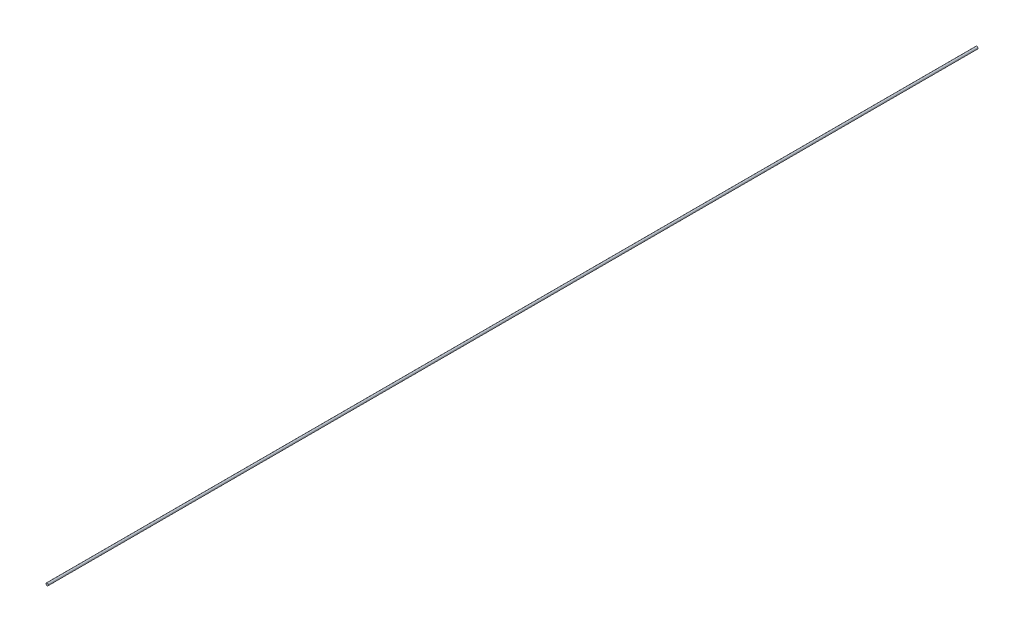
ISO-10303-21;
HEADER;
FILE_DESCRIPTION(('STEP AP214'),'2;1');
FILE_NAME('part.step','',(''),(''),'','','');
FILE_SCHEMA(('AUTOMOTIVE_DESIGN { 1 0 10303 214 1 1 1 1 }'));
ENDSEC;
DATA;
#1=APPLICATION_CONTEXT('core data for automotive mechanical design processes');
#2=APPLICATION_PROTOCOL_DEFINITION('international standard','automotive_design',2000,#1);
#3=PRODUCT_CONTEXT('',#1,'mechanical');
#4=PRODUCT('Part','Part','',(#3));
#5=PRODUCT_RELATED_PRODUCT_CATEGORY('part','',(#4));
#6=PRODUCT_DEFINITION_FORMATION('','',#4);
#7=PRODUCT_DEFINITION_CONTEXT('part definition',#1,'design');
#8=PRODUCT_DEFINITION('design','',#6,#7);
#9=PRODUCT_DEFINITION_SHAPE('','',#8);
#10=(LENGTH_UNIT() NAMED_UNIT(*) SI_UNIT(.MILLI.,.METRE.));
#11=(NAMED_UNIT(*) PLANE_ANGLE_UNIT() SI_UNIT($,.RADIAN.));
#12=(NAMED_UNIT(*) SI_UNIT($,.STERADIAN.) SOLID_ANGLE_UNIT());
#13=UNCERTAINTY_MEASURE_WITH_UNIT(LENGTH_MEASURE(1.E-05),#10,'distance_accuracy_value','');
#14=(GEOMETRIC_REPRESENTATION_CONTEXT(3) GLOBAL_UNCERTAINTY_ASSIGNED_CONTEXT((#13)) GLOBAL_UNIT_ASSIGNED_CONTEXT((#10,
#11,#12)) REPRESENTATION_CONTEXT('',''));
#15=CARTESIAN_POINT('',(0.,0.,0.));
#16=DIRECTION('',(0.,0.,1.));
#17=DIRECTION('',(1.,0.,0.));
#18=AXIS2_PLACEMENT_3D('',#15,#16,#17);
#19=CARTESIAN_POINT('',(0.,0.,400.));
#20=DIRECTION('',(0.,0.,-1.));
#21=DIRECTION('',(-1.,0.,0.));
#22=AXIS2_PLACEMENT_3D('',#19,#20,#21);
#23=CYLINDRICAL_SURFACE('',#22,0.5);
#24=CARTESIAN_POINT('',(0.,0.,400.));
#25=DIRECTION('',(0.,0.,1.));
#26=DIRECTION('',(1.,0.,0.));
#27=AXIS2_PLACEMENT_3D('',#24,#25,#26);
#28=CIRCLE('',#27,0.5);
#29=CARTESIAN_POINT('',(0.5,0.,400.));
#30=VERTEX_POINT('',#29);
#31=EDGE_CURVE('E10',#30,#30,#28,.T.);
#32=ORIENTED_EDGE('',*,*,#31,.F.);
#33=EDGE_LOOP('',(#32));
#34=FACE_BOUND('',#33,.T.);
#35=CARTESIAN_POINT('',(0.,0.,0.));
#36=DIRECTION('',(0.,0.,1.));
#37=DIRECTION('',(1.,0.,0.));
#38=AXIS2_PLACEMENT_3D('',#35,#36,#37);
#39=CIRCLE('',#38,0.5);
#40=CARTESIAN_POINT('',(0.5,0.,0.));
#41=VERTEX_POINT('',#40);
#42=EDGE_CURVE('E35',#41,#41,#39,.T.);
#43=ORIENTED_EDGE('',*,*,#42,.T.);
#44=EDGE_LOOP('',(#43));
#45=FACE_BOUND('',#44,.T.);
#46=ADVANCED_FACE('F32',(#34,#45),#23,.T.);
#47=CARTESIAN_POINT('',(0.,0.,400.));
#48=DIRECTION('',(0.,0.,1.));
#49=DIRECTION('',(1.,0.,0.));
#50=AXIS2_PLACEMENT_3D('',#47,#48,#49);
#51=PLANE('',#50);
#52=ORIENTED_EDGE('',*,*,#31,.T.);
#53=EDGE_LOOP('',(#52));
#54=FACE_BOUND('',#53,.T.);
#55=ADVANCED_FACE('F47',(#54),#51,.T.);
#56=CARTESIAN_POINT('',(0.,0.,0.));
#57=DIRECTION('',(0.,0.,1.));
#58=DIRECTION('',(1.,0.,0.));
#59=AXIS2_PLACEMENT_3D('',#56,#57,#58);
#60=PLANE('',#59);
#61=ORIENTED_EDGE('',*,*,#42,.F.);
#62=EDGE_LOOP('',(#61));
#63=FACE_BOUND('',#62,.T.);
#64=ADVANCED_FACE('F45',(#63),#60,.F.);
#65=CLOSED_SHELL('',(#46,#55,#64));
#66=MANIFOLD_SOLID_BREP('B2',#65);
#67=ADVANCED_BREP_SHAPE_REPRESENTATION('',(#18,#66),#14);
#68=SHAPE_DEFINITION_REPRESENTATION(#9,#67);
ENDSEC;
END-ISO-10303-21;
